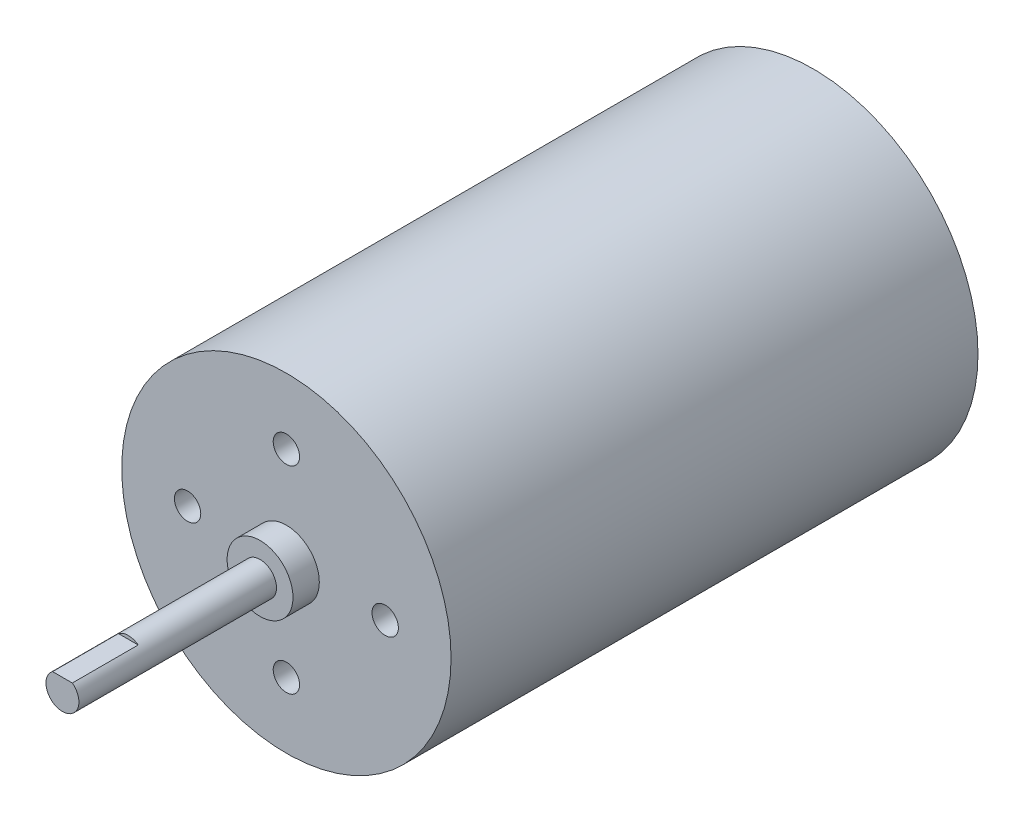
ISO-10303-21;
HEADER;
FILE_DESCRIPTION(('STEP AP214'),'2;1');
FILE_NAME('part.step','',(''),(''),'','','');
FILE_SCHEMA(('AUTOMOTIVE_DESIGN { 1 0 10303 214 1 1 1 1 }'));
ENDSEC;
DATA;
#1=APPLICATION_CONTEXT('core data for automotive mechanical design processes');
#2=APPLICATION_PROTOCOL_DEFINITION('international standard','automotive_design',2000,#1);
#3=PRODUCT_CONTEXT('',#1,'mechanical');
#4=PRODUCT('Part','Part','',(#3));
#5=PRODUCT_RELATED_PRODUCT_CATEGORY('part','',(#4));
#6=PRODUCT_DEFINITION_FORMATION('','',#4);
#7=PRODUCT_DEFINITION_CONTEXT('part definition',#1,'design');
#8=PRODUCT_DEFINITION('design','',#6,#7);
#9=PRODUCT_DEFINITION_SHAPE('','',#8);
#10=(LENGTH_UNIT() NAMED_UNIT(*) SI_UNIT(.MILLI.,.METRE.));
#11=(NAMED_UNIT(*) PLANE_ANGLE_UNIT() SI_UNIT($,.RADIAN.));
#12=(NAMED_UNIT(*) SI_UNIT($,.STERADIAN.) SOLID_ANGLE_UNIT());
#13=UNCERTAINTY_MEASURE_WITH_UNIT(LENGTH_MEASURE(1.E-05),#10,'distance_accuracy_value','');
#14=(GEOMETRIC_REPRESENTATION_CONTEXT(3) GLOBAL_UNCERTAINTY_ASSIGNED_CONTEXT((#13)) GLOBAL_UNIT_ASSIGNED_CONTEXT((#10,
#11,#12)) REPRESENTATION_CONTEXT('',''));
#15=CARTESIAN_POINT('',(0.,0.,0.));
#16=DIRECTION('',(0.,0.,1.));
#17=DIRECTION('',(1.,0.,0.));
#18=AXIS2_PLACEMENT_3D('',#15,#16,#17);
#19=CARTESIAN_POINT('',(0.,0.,53.34));
#20=DIRECTION('',(0.,0.,1.));
#21=DIRECTION('',(1.,0.,0.));
#22=AXIS2_PLACEMENT_3D('',#19,#20,#21);
#23=PLANE('',#22);
#24=CARTESIAN_POINT('',(0.,0.,53.34));
#25=DIRECTION('',(0.,0.,1.));
#26=DIRECTION('',(1.,0.,0.));
#27=AXIS2_PLACEMENT_3D('',#24,#25,#26);
#28=CIRCLE('',#27,3.175);
#29=CARTESIAN_POINT('',(3.175,0.,53.34));
#30=VERTEX_POINT('',#29);
#31=EDGE_CURVE('E77',#30,#30,#28,.T.);
#32=ORIENTED_EDGE('',*,*,#31,.T.);
#33=EDGE_LOOP('',(#32));
#34=FACE_BOUND('',#33,.T.);
#35=CARTESIAN_POINT('',(0.,0.,53.34));
#36=DIRECTION('',(0.,0.,1.));
#37=DIRECTION('',(1.,0.,0.));
#38=AXIS2_PLACEMENT_3D('',#35,#36,#37);
#39=CIRCLE('',#38,1.5875);
#40=CARTESIAN_POINT('',(1.5875,0.,53.34));
#41=VERTEX_POINT('',#40);
#42=EDGE_CURVE('E71',#41,#41,#39,.T.);
#43=ORIENTED_EDGE('',*,*,#42,.F.);
#44=EDGE_LOOP('',(#43));
#45=FACE_BOUND('',#44,.T.);
#46=ADVANCED_FACE('F32',(#34,#45),#23,.T.);
#47=CARTESIAN_POINT('',(0.,0.,50.8));
#48=DIRECTION('',(0.,0.,1.));
#49=DIRECTION('',(1.,0.,0.));
#50=AXIS2_PLACEMENT_3D('',#47,#48,#49);
#51=PLANE('',#50);
#52=CARTESIAN_POINT('',(-9.52499999999973,-2.70716782324598E-13,50.8));
#53=DIRECTION('',(0.,0.,1.));
#54=DIRECTION('',(1.,0.,0.));
#55=AXIS2_PLACEMENT_3D('',#52,#53,#54);
#56=CIRCLE('',#55,1.27000000000043);
#57=CARTESIAN_POINT('',(-8.2549999999993,-2.70716782324598E-13,50.8));
#58=VERTEX_POINT('',#57);
#59=EDGE_CURVE('E311',#58,#58,#56,.T.);
#60=ORIENTED_EDGE('',*,*,#59,.F.);
#61=EDGE_LOOP('',(#60));
#62=FACE_BOUND('',#61,.T.);
#63=CARTESIAN_POINT('',(5.39100612496821E-13,-9.525,50.8));
#64=DIRECTION('',(0.,0.,1.));
#65=DIRECTION('',(1.,0.,0.));
#66=AXIS2_PLACEMENT_3D('',#63,#64,#65);
#67=CIRCLE('',#66,1.27000000000058);
#68=CARTESIAN_POINT('',(1.27000000000112,-9.525,50.8));
#69=VERTEX_POINT('',#68);
#70=EDGE_CURVE('E310',#69,#69,#67,.T.);
#71=ORIENTED_EDGE('',*,*,#70,.F.);
#72=EDGE_LOOP('',(#71));
#73=FACE_BOUND('',#72,.T.);
#74=CARTESIAN_POINT('',(9.52500000000027,2.6955030624841E-13,50.8));
#75=DIRECTION('',(0.,0.,1.));
#76=DIRECTION('',(1.,0.,0.));
#77=AXIS2_PLACEMENT_3D('',#74,#75,#76);
#78=CIRCLE('',#77,1.27000000000021);
#79=CARTESIAN_POINT('',(10.7950000000005,2.6955030624841E-13,50.8));
#80=VERTEX_POINT('',#79);
#81=EDGE_CURVE('E320',#80,#80,#78,.T.);
#82=ORIENTED_EDGE('',*,*,#81,.F.);
#83=EDGE_LOOP('',(#82));
#84=FACE_BOUND('',#83,.T.);
#85=CARTESIAN_POINT('',(0.,9.525,50.8));
#86=DIRECTION('',(0.,0.,1.));
#87=DIRECTION('',(1.,0.,0.));
#88=AXIS2_PLACEMENT_3D('',#85,#86,#87);
#89=CIRCLE('',#88,1.27);
#90=CARTESIAN_POINT('',(1.27,9.525,50.8));
#91=VERTEX_POINT('',#90);
#92=EDGE_CURVE('E325',#91,#91,#89,.T.);
#93=ORIENTED_EDGE('',*,*,#92,.F.);
#94=EDGE_LOOP('',(#93));
#95=FACE_BOUND('',#94,.T.);
#96=CARTESIAN_POINT('',(0.,0.,50.8));
#97=DIRECTION('',(0.,0.,1.));
#98=DIRECTION('',(1.,0.,0.));
#99=AXIS2_PLACEMENT_3D('',#96,#97,#98);
#100=CIRCLE('',#99,15.875);
#101=CARTESIAN_POINT('',(15.875,0.,50.8));
#102=VERTEX_POINT('',#101);
#103=EDGE_CURVE('E40',#102,#102,#100,.T.);
#104=ORIENTED_EDGE('',*,*,#103,.T.);
#105=EDGE_LOOP('',(#104));
#106=FACE_BOUND('',#105,.T.);
#107=CARTESIAN_POINT('',(0.,0.,50.8));
#108=DIRECTION('',(0.,0.,1.));
#109=DIRECTION('',(1.,0.,0.));
#110=AXIS2_PLACEMENT_3D('',#107,#108,#109);
#111=CIRCLE('',#110,3.175);
#112=CARTESIAN_POINT('',(3.175,0.,50.8));
#113=VERTEX_POINT('',#112);
#114=EDGE_CURVE('E74',#113,#113,#111,.T.);
#115=ORIENTED_EDGE('',*,*,#114,.F.);
#116=EDGE_LOOP('',(#115));
#117=FACE_BOUND('',#116,.T.);
#118=ADVANCED_FACE('F123',(#62,#73,#84,#95,#106,#117),#51,.T.);
#119=CARTESIAN_POINT('',(0.,0.,-6.35));
#120=DIRECTION('',(0.,0.,-1.));
#121=DIRECTION('',(-1.,0.,0.));
#122=AXIS2_PLACEMENT_3D('',#119,#120,#121);
#123=PLANE('',#122);
#124=CARTESIAN_POINT('',(0.,0.,-6.35));
#125=DIRECTION('',(0.,0.,-1.));
#126=DIRECTION('',(-1.,0.,0.));
#127=AXIS2_PLACEMENT_3D('',#124,#125,#126);
#128=CIRCLE('',#127,6.35);
#129=CARTESIAN_POINT('',(-6.35,0.,-6.35));
#130=VERTEX_POINT('',#129);
#131=EDGE_CURVE('E89',#130,#130,#128,.T.);
#132=ORIENTED_EDGE('',*,*,#131,.T.);
#133=EDGE_LOOP('',(#132));
#134=FACE_BOUND('',#133,.T.);
#135=CARTESIAN_POINT('',(0.,0.,-6.35));
#136=DIRECTION('',(0.,0.,-1.));
#137=DIRECTION('',(-1.,0.,0.));
#138=AXIS2_PLACEMENT_3D('',#135,#136,#137);
#139=CIRCLE('',#138,1.5875);
#140=CARTESIAN_POINT('',(-1.5875,0.,-6.35));
#141=VERTEX_POINT('',#140);
#142=EDGE_CURVE('E84',#141,#141,#139,.T.);
#143=ORIENTED_EDGE('',*,*,#142,.F.);
#144=EDGE_LOOP('',(#143));
#145=FACE_BOUND('',#144,.T.);
#146=ADVANCED_FACE('F103',(#134,#145),#123,.T.);
#147=CARTESIAN_POINT('',(0.,0.,0.));
#148=DIRECTION('',(0.,0.,1.));
#149=DIRECTION('',(1.,0.,0.));
#150=AXIS2_PLACEMENT_3D('',#147,#148,#149);
#151=PLANE('',#150);
#152=CARTESIAN_POINT('',(0.,0.,0.));
#153=DIRECTION('',(0.,0.,1.));
#154=DIRECTION('',(1.,0.,0.));
#155=AXIS2_PLACEMENT_3D('',#152,#153,#154);
#156=CIRCLE('',#155,15.875);
#157=CARTESIAN_POINT('',(15.875,0.,0.));
#158=VERTEX_POINT('',#157);
#159=EDGE_CURVE('E94',#158,#158,#156,.T.);
#160=ORIENTED_EDGE('',*,*,#159,.F.);
#161=EDGE_LOOP('',(#160));
#162=FACE_BOUND('',#161,.T.);
#163=CARTESIAN_POINT('',(0.,0.,0.));
#164=DIRECTION('',(0.,0.,1.));
#165=DIRECTION('',(1.,0.,0.));
#166=AXIS2_PLACEMENT_3D('',#163,#164,#165);
#167=CIRCLE('',#166,6.35);
#168=CARTESIAN_POINT('',(6.35,0.,0.));
#169=VERTEX_POINT('',#168);
#170=EDGE_CURVE('E11',#169,#169,#167,.F.);
#171=ORIENTED_EDGE('',*,*,#170,.F.);
#172=EDGE_LOOP('',(#171));
#173=FACE_BOUND('',#172,.T.);
#174=ADVANCED_FACE('F100',(#162,#173),#151,.F.);
#175=CARTESIAN_POINT('',(0.,0.,50.8));
#176=DIRECTION('',(0.,0.,-1.));
#177=DIRECTION('',(-1.,0.,0.));
#178=AXIS2_PLACEMENT_3D('',#175,#176,#177);
#179=CYLINDRICAL_SURFACE('',#178,15.875);
#180=ORIENTED_EDGE('',*,*,#103,.F.);
#181=EDGE_LOOP('',(#180));
#182=FACE_BOUND('',#181,.T.);
#183=ORIENTED_EDGE('',*,*,#159,.T.);
#184=EDGE_LOOP('',(#183));
#185=FACE_BOUND('',#184,.T.);
#186=ADVANCED_FACE('F34',(#182,#185),#179,.T.);
#187=CARTESIAN_POINT('',(0.,0.,-6.35));
#188=DIRECTION('',(0.,0.,1.));
#189=DIRECTION('',(1.,0.,0.));
#190=AXIS2_PLACEMENT_3D('',#187,#188,#189);
#191=CYLINDRICAL_SURFACE('',#190,6.35);
#192=ORIENTED_EDGE('',*,*,#131,.F.);
#193=EDGE_LOOP('',(#192));
#194=FACE_BOUND('',#193,.T.);
#195=ORIENTED_EDGE('',*,*,#170,.T.);
#196=EDGE_LOOP('',(#195));
#197=FACE_BOUND('',#196,.T.);
#198=ADVANCED_FACE('F106',(#194,#197),#191,.T.);
#199=CARTESIAN_POINT('',(0.,0.,-9.525));
#200=DIRECTION('',(0.,0.,1.));
#201=DIRECTION('',(1.,0.,0.));
#202=AXIS2_PLACEMENT_3D('',#199,#200,#201);
#203=CYLINDRICAL_SURFACE('',#202,1.5875);
#204=CARTESIAN_POINT('',(0.,0.,-9.525));
#205=DIRECTION('',(0.,0.,-1.));
#206=DIRECTION('',(-1.,0.,0.));
#207=AXIS2_PLACEMENT_3D('',#204,#205,#206);
#208=CIRCLE('',#207,1.5875);
#209=CARTESIAN_POINT('',(-1.5875,0.,-9.525));
#210=VERTEX_POINT('',#209);
#211=EDGE_CURVE('E86',#210,#210,#208,.T.);
#212=ORIENTED_EDGE('',*,*,#211,.F.);
#213=EDGE_LOOP('',(#212));
#214=FACE_BOUND('',#213,.T.);
#215=ORIENTED_EDGE('',*,*,#142,.T.);
#216=EDGE_LOOP('',(#215));
#217=FACE_BOUND('',#216,.T.);
#218=ADVANCED_FACE('F108',(#214,#217),#203,.T.);
#219=CARTESIAN_POINT('',(0.,0.,-9.525));
#220=DIRECTION('',(0.,0.,-1.));
#221=DIRECTION('',(-1.,0.,0.));
#222=AXIS2_PLACEMENT_3D('',#219,#220,#221);
#223=PLANE('',#222);
#224=ORIENTED_EDGE('',*,*,#211,.T.);
#225=EDGE_LOOP('',(#224));
#226=FACE_BOUND('',#225,.T.);
#227=ADVANCED_FACE('F115',(#226),#223,.T.);
#228=CARTESIAN_POINT('',(0.,0.,53.34));
#229=DIRECTION('',(0.,0.,-1.));
#230=DIRECTION('',(-1.,0.,0.));
#231=AXIS2_PLACEMENT_3D('',#228,#229,#230);
#232=CYLINDRICAL_SURFACE('',#231,3.175);
#233=ORIENTED_EDGE('',*,*,#31,.F.);
#234=EDGE_LOOP('',(#233));
#235=FACE_BOUND('',#234,.T.);
#236=ORIENTED_EDGE('',*,*,#114,.T.);
#237=EDGE_LOOP('',(#236));
#238=FACE_BOUND('',#237,.T.);
#239=ADVANCED_FACE('F134',(#235,#238),#232,.T.);
#240=CARTESIAN_POINT('',(0.,0.,72.39));
#241=DIRECTION('',(0.,0.,-1.));
#242=DIRECTION('',(-1.,0.,0.));
#243=AXIS2_PLACEMENT_3D('',#240,#241,#242);
#244=CYLINDRICAL_SURFACE('',#243,1.5875);
#245=CARTESIAN_POINT('',(0.,0.,72.39));
#246=DIRECTION('',(0.,0.,1.));
#247=DIRECTION('',(1.,0.,0.));
#248=AXIS2_PLACEMENT_3D('',#245,#246,#247);
#249=CIRCLE('',#248,1.5875);
#250=CARTESIAN_POINT('',(-0.9525,1.27,72.39));
#251=VERTEX_POINT('',#250);
#252=CARTESIAN_POINT('',(0.9525,1.27,72.39));
#253=VERTEX_POINT('',#252);
#254=EDGE_CURVE('E70',#251,#253,#249,.T.);
#255=ORIENTED_EDGE('',*,*,#254,.F.);
#256=DIRECTION('',(0.,0.,1.));
#257=VECTOR('',#256,1.);
#258=CARTESIAN_POINT('',(-0.9525,1.27,66.04));
#259=LINE('',#258,#257);
#260=CARTESIAN_POINT('',(-0.9525,1.27,66.04));
#261=VERTEX_POINT('',#260);
#262=EDGE_CURVE('E47',#261,#251,#259,.T.);
#263=ORIENTED_EDGE('',*,*,#262,.F.);
#264=CARTESIAN_POINT('',(0.,0.,66.04));
#265=DIRECTION('',(0.,0.,1.));
#266=DIRECTION('',(1.,0.,0.));
#267=AXIS2_PLACEMENT_3D('',#264,#265,#266);
#268=CIRCLE('',#267,1.5875);
#269=CARTESIAN_POINT('',(0.9525,1.27,66.04));
#270=VERTEX_POINT('',#269);
#271=EDGE_CURVE('E63',#270,#261,#268,.T.);
#272=ORIENTED_EDGE('',*,*,#271,.F.);
#273=DIRECTION('',(0.,0.,1.));
#274=VECTOR('',#273,1.);
#275=CARTESIAN_POINT('',(0.9525,1.27,66.04));
#276=LINE('',#275,#274);
#277=EDGE_CURVE('E53',#270,#253,#276,.T.);
#278=ORIENTED_EDGE('',*,*,#277,.T.);
#279=EDGE_LOOP('',(#255,#263,#272,#278));
#280=FACE_BOUND('',#279,.T.);
#281=ORIENTED_EDGE('',*,*,#42,.T.);
#282=EDGE_LOOP('',(#281));
#283=FACE_BOUND('',#282,.T.);
#284=ADVANCED_FACE('F68',(#280,#283),#244,.T.);
#285=CARTESIAN_POINT('',(0.,0.,72.39));
#286=DIRECTION('',(0.,0.,1.));
#287=DIRECTION('',(1.,0.,0.));
#288=AXIS2_PLACEMENT_3D('',#285,#286,#287);
#289=PLANE('',#288);
#290=DIRECTION('',(1.,0.,0.));
#291=VECTOR('',#290,1.);
#292=CARTESIAN_POINT('',(0.,1.27,72.39));
#293=LINE('',#292,#291);
#294=EDGE_CURVE('E58',#251,#253,#293,.T.);
#295=ORIENTED_EDGE('',*,*,#294,.F.);
#296=ORIENTED_EDGE('',*,*,#254,.T.);
#297=EDGE_LOOP('',(#295,#296));
#298=FACE_BOUND('',#297,.T.);
#299=ADVANCED_FACE('F73',(#298),#289,.T.);
#300=CARTESIAN_POINT('',(0.,1.27,66.04));
#301=DIRECTION('',(0.,-1.,0.));
#302=DIRECTION('',(0.,0.,-1.));
#303=AXIS2_PLACEMENT_3D('',#300,#301,#302);
#304=PLANE('',#303);
#305=ORIENTED_EDGE('',*,*,#294,.T.);
#306=ORIENTED_EDGE('',*,*,#277,.F.);
#307=DIRECTION('',(1.,0.,0.));
#308=VECTOR('',#307,1.);
#309=CARTESIAN_POINT('',(0.,1.27,66.04));
#310=LINE('',#309,#308);
#311=EDGE_CURVE('E333',#261,#270,#310,.T.);
#312=ORIENTED_EDGE('',*,*,#311,.F.);
#313=ORIENTED_EDGE('',*,*,#262,.T.);
#314=EDGE_LOOP('',(#305,#306,#312,#313));
#315=FACE_BOUND('',#314,.T.);
#316=ADVANCED_FACE('F59',(#315),#304,.F.);
#317=CARTESIAN_POINT('',(0.,0.,66.04));
#318=DIRECTION('',(0.,0.,1.));
#319=DIRECTION('',(1.,0.,0.));
#320=AXIS2_PLACEMENT_3D('',#317,#318,#319);
#321=PLANE('',#320);
#322=ORIENTED_EDGE('',*,*,#271,.T.);
#323=ORIENTED_EDGE('',*,*,#311,.T.);
#324=EDGE_LOOP('',(#322,#323));
#325=FACE_BOUND('',#324,.T.);
#326=ADVANCED_FACE('F212',(#325),#321,.T.);
#327=CARTESIAN_POINT('',(0.,9.525,41.91));
#328=DIRECTION('',(0.,0.,1.));
#329=DIRECTION('',(1.,0.,0.));
#330=AXIS2_PLACEMENT_3D('',#327,#328,#329);
#331=CYLINDRICAL_SURFACE('',#330,1.27);
#332=CARTESIAN_POINT('',(0.,9.525,41.91));
#333=DIRECTION('',(0.,0.,1.));
#334=DIRECTION('',(1.,0.,0.));
#335=AXIS2_PLACEMENT_3D('',#332,#333,#334);
#336=CIRCLE('',#335,1.27);
#337=CARTESIAN_POINT('',(1.27,9.525,41.91));
#338=VERTEX_POINT('',#337);
#339=EDGE_CURVE('E64',#338,#338,#336,.T.);
#340=ORIENTED_EDGE('',*,*,#339,.F.);
#341=EDGE_LOOP('',(#340));
#342=FACE_BOUND('',#341,.T.);
#343=ORIENTED_EDGE('',*,*,#92,.T.);
#344=EDGE_LOOP('',(#343));
#345=FACE_BOUND('',#344,.T.);
#346=ADVANCED_FACE('F219',(#342,#345),#331,.F.);
#347=CARTESIAN_POINT('',(0.,9.525,41.91));
#348=DIRECTION('',(0.,0.,1.));
#349=DIRECTION('',(1.,0.,0.));
#350=AXIS2_PLACEMENT_3D('',#347,#348,#349);
#351=PLANE('',#350);
#352=ORIENTED_EDGE('',*,*,#339,.T.);
#353=EDGE_LOOP('',(#352));
#354=FACE_BOUND('',#353,.T.);
#355=ADVANCED_FACE('F227',(#354),#351,.T.);
#356=CARTESIAN_POINT('',(9.52500000000027,2.6955030624841E-13,41.91));
#357=DIRECTION('',(0.,0.,1.));
#358=DIRECTION('',(1.,0.,0.));
#359=AXIS2_PLACEMENT_3D('',#356,#357,#358);
#360=CYLINDRICAL_SURFACE('',#359,1.27000000000021);
#361=CARTESIAN_POINT('',(9.52500000000027,2.6955030624841E-13,41.91));
#362=DIRECTION('',(0.,0.,1.));
#363=DIRECTION('',(1.,0.,0.));
#364=AXIS2_PLACEMENT_3D('',#361,#362,#363);
#365=CIRCLE('',#364,1.27000000000021);
#366=CARTESIAN_POINT('',(10.7950000000005,2.6955030624841E-13,41.91));
#367=VERTEX_POINT('',#366);
#368=EDGE_CURVE('E322',#367,#367,#365,.T.);
#369=ORIENTED_EDGE('',*,*,#368,.F.);
#370=EDGE_LOOP('',(#369));
#371=FACE_BOUND('',#370,.T.);
#372=ORIENTED_EDGE('',*,*,#81,.T.);
#373=EDGE_LOOP('',(#372));
#374=FACE_BOUND('',#373,.T.);
#375=ADVANCED_FACE('F236',(#371,#374),#360,.F.);
#376=CARTESIAN_POINT('',(9.52500000000027,2.6955030624841E-13,41.91));
#377=DIRECTION('',(0.,0.,1.));
#378=DIRECTION('',(1.,0.,0.));
#379=AXIS2_PLACEMENT_3D('',#376,#377,#378);
#380=PLANE('',#379);
#381=ORIENTED_EDGE('',*,*,#368,.T.);
#382=EDGE_LOOP('',(#381));
#383=FACE_BOUND('',#382,.T.);
#384=ADVANCED_FACE('F245',(#383),#380,.T.);
#385=CARTESIAN_POINT('',(5.39100612496821E-13,-9.525,41.91));
#386=DIRECTION('',(0.,0.,1.));
#387=DIRECTION('',(1.,0.,0.));
#388=AXIS2_PLACEMENT_3D('',#385,#386,#387);
#389=CYLINDRICAL_SURFACE('',#388,1.27000000000058);
#390=CARTESIAN_POINT('',(5.39100612496821E-13,-9.525,41.91));
#391=DIRECTION('',(0.,0.,1.));
#392=DIRECTION('',(1.,0.,0.));
#393=AXIS2_PLACEMENT_3D('',#390,#391,#392);
#394=CIRCLE('',#393,1.27000000000058);
#395=CARTESIAN_POINT('',(1.27000000000112,-9.525,41.91));
#396=VERTEX_POINT('',#395);
#397=EDGE_CURVE('E314',#396,#396,#394,.T.);
#398=ORIENTED_EDGE('',*,*,#397,.F.);
#399=EDGE_LOOP('',(#398));
#400=FACE_BOUND('',#399,.T.);
#401=ORIENTED_EDGE('',*,*,#70,.T.);
#402=EDGE_LOOP('',(#401));
#403=FACE_BOUND('',#402,.T.);
#404=ADVANCED_FACE('F254',(#400,#403),#389,.F.);
#405=CARTESIAN_POINT('',(5.39100612496821E-13,-9.525,41.91));
#406=DIRECTION('',(0.,0.,1.));
#407=DIRECTION('',(1.,0.,0.));
#408=AXIS2_PLACEMENT_3D('',#405,#406,#407);
#409=PLANE('',#408);
#410=ORIENTED_EDGE('',*,*,#397,.T.);
#411=EDGE_LOOP('',(#410));
#412=FACE_BOUND('',#411,.T.);
#413=ADVANCED_FACE('F263',(#412),#409,.T.);
#414=CARTESIAN_POINT('',(-9.52499999999973,-2.70716782324598E-13,41.91));
#415=DIRECTION('',(0.,0.,1.));
#416=DIRECTION('',(1.,0.,0.));
#417=AXIS2_PLACEMENT_3D('',#414,#415,#416);
#418=CYLINDRICAL_SURFACE('',#417,1.27000000000043);
#419=CARTESIAN_POINT('',(-9.52499999999973,-2.70716782324598E-13,41.91));
#420=DIRECTION('',(0.,0.,1.));
#421=DIRECTION('',(1.,0.,0.));
#422=AXIS2_PLACEMENT_3D('',#419,#420,#421);
#423=CIRCLE('',#422,1.27000000000043);
#424=CARTESIAN_POINT('',(-8.2549999999993,-2.70716782324598E-13,41.91));
#425=VERTEX_POINT('',#424);
#426=EDGE_CURVE('E309',#425,#425,#423,.T.);
#427=ORIENTED_EDGE('',*,*,#426,.F.);
#428=EDGE_LOOP('',(#427));
#429=FACE_BOUND('',#428,.T.);
#430=ORIENTED_EDGE('',*,*,#59,.T.);
#431=EDGE_LOOP('',(#430));
#432=FACE_BOUND('',#431,.T.);
#433=ADVANCED_FACE('F272',(#429,#432),#418,.F.);
#434=CARTESIAN_POINT('',(-9.52499999999973,-2.70716782324598E-13,41.91));
#435=DIRECTION('',(0.,0.,1.));
#436=DIRECTION('',(1.,0.,0.));
#437=AXIS2_PLACEMENT_3D('',#434,#435,#436);
#438=PLANE('',#437);
#439=ORIENTED_EDGE('',*,*,#426,.T.);
#440=EDGE_LOOP('',(#439));
#441=FACE_BOUND('',#440,.T.);
#442=ADVANCED_FACE('F281',(#441),#438,.T.);
#443=CLOSED_SHELL('',(#46,#118,#146,#174,#186,#198,#218,#227,#239,#284,#299,#316,#326,#346,#355,
#375,#384,#404,#413,#433,#442));
#444=MANIFOLD_SOLID_BREP('B2',#443);
#445=ADVANCED_BREP_SHAPE_REPRESENTATION('',(#18,#444),#14);
#446=SHAPE_DEFINITION_REPRESENTATION(#9,#445);
ENDSEC;
END-ISO-10303-21;
